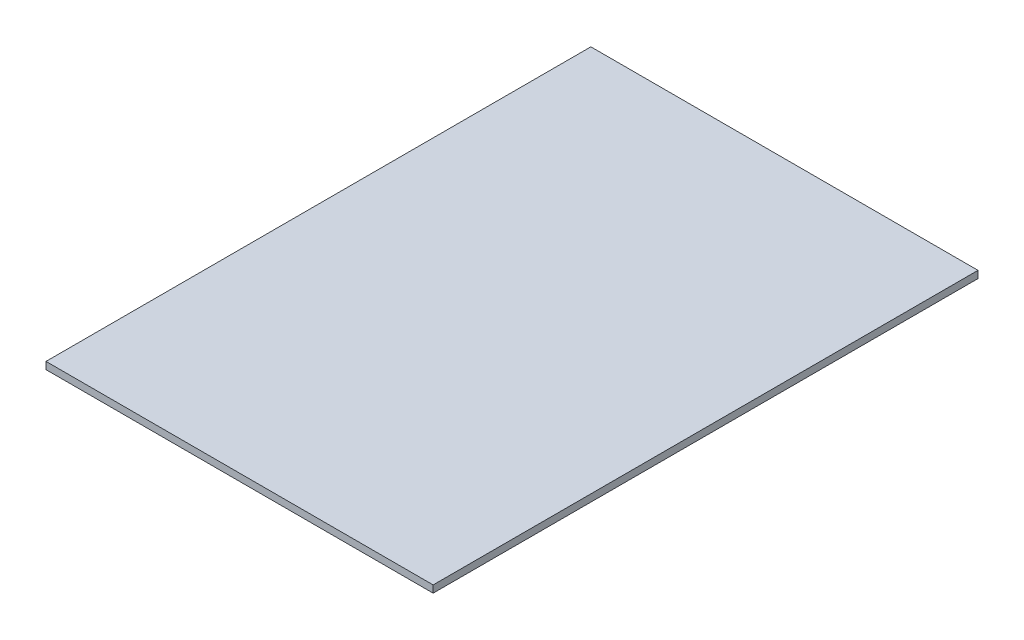
ISO-10303-21;
HEADER;
FILE_DESCRIPTION(('STEP AP214'),'2;1');
FILE_NAME('part.step','',(''),(''),'','','');
FILE_SCHEMA(('AUTOMOTIVE_DESIGN { 1 0 10303 214 1 1 1 1 }'));
ENDSEC;
DATA;
#1=APPLICATION_CONTEXT('core data for automotive mechanical design processes');
#2=APPLICATION_PROTOCOL_DEFINITION('international standard','automotive_design',2000,#1);
#3=PRODUCT_CONTEXT('',#1,'mechanical');
#4=PRODUCT('Part','Part','',(#3));
#5=PRODUCT_RELATED_PRODUCT_CATEGORY('part','',(#4));
#6=PRODUCT_DEFINITION_FORMATION('','',#4);
#7=PRODUCT_DEFINITION_CONTEXT('part definition',#1,'design');
#8=PRODUCT_DEFINITION('design','',#6,#7);
#9=PRODUCT_DEFINITION_SHAPE('','',#8);
#10=(LENGTH_UNIT() NAMED_UNIT(*) SI_UNIT(.MILLI.,.METRE.));
#11=(NAMED_UNIT(*) PLANE_ANGLE_UNIT() SI_UNIT($,.RADIAN.));
#12=(NAMED_UNIT(*) SI_UNIT($,.STERADIAN.) SOLID_ANGLE_UNIT());
#13=UNCERTAINTY_MEASURE_WITH_UNIT(LENGTH_MEASURE(1.E-05),#10,'distance_accuracy_value','');
#14=(GEOMETRIC_REPRESENTATION_CONTEXT(3) GLOBAL_UNCERTAINTY_ASSIGNED_CONTEXT((#13)) GLOBAL_UNIT_ASSIGNED_CONTEXT((#10,
#11,#12)) REPRESENTATION_CONTEXT('',''));
#15=CARTESIAN_POINT('',(0.,0.,0.));
#16=DIRECTION('',(0.,0.,1.));
#17=DIRECTION('',(1.,0.,0.));
#18=AXIS2_PLACEMENT_3D('',#15,#16,#17);
#19=CARTESIAN_POINT('',(5.00000000000006,44.9999999999995,380.));
#20=DIRECTION('',(1.,0.,0.));
#21=DIRECTION('',(0.,0.,-1.));
#22=AXIS2_PLACEMENT_3D('',#19,#20,#21);
#23=PLANE('',#22);
#24=DIRECTION('',(0.,-1.,0.));
#25=VECTOR('',#24,1.);
#26=CARTESIAN_POINT('',(5.00000000000006,44.9999999999995,0.));
#27=LINE('',#26,#25);
#28=CARTESIAN_POINT('',(5.00000000000006,49.9999999999995,0.));
#29=VERTEX_POINT('',#28);
#30=CARTESIAN_POINT('',(5.00000000000006,44.9999999999995,0.));
#31=VERTEX_POINT('',#30);
#32=EDGE_CURVE('E96',#29,#31,#27,.T.);
#33=ORIENTED_EDGE('',*,*,#32,.T.);
#34=DIRECTION('',(0.,0.,-1.));
#35=VECTOR('',#34,1.);
#36=CARTESIAN_POINT('',(5.00000000000006,44.9999999999995,380.));
#37=LINE('',#36,#35);
#38=CARTESIAN_POINT('',(5.00000000000006,44.9999999999995,380.));
#39=VERTEX_POINT('',#38);
#40=EDGE_CURVE('E11',#39,#31,#37,.T.);
#41=ORIENTED_EDGE('',*,*,#40,.F.);
#42=DIRECTION('',(0.,-1.,0.));
#43=VECTOR('',#42,1.);
#44=CARTESIAN_POINT('',(5.00000000000006,44.9999999999995,380.));
#45=LINE('',#44,#43);
#46=CARTESIAN_POINT('',(5.00000000000006,49.9999999999995,380.));
#47=VERTEX_POINT('',#46);
#48=EDGE_CURVE('E84',#47,#39,#45,.T.);
#49=ORIENTED_EDGE('',*,*,#48,.F.);
#50=DIRECTION('',(0.,0.,-1.));
#51=VECTOR('',#50,1.);
#52=CARTESIAN_POINT('',(5.00000000000006,49.9999999999995,380.));
#53=LINE('',#52,#51);
#54=EDGE_CURVE('E92',#47,#29,#53,.T.);
#55=ORIENTED_EDGE('',*,*,#54,.T.);
#56=EDGE_LOOP('',(#33,#41,#49,#55));
#57=FACE_BOUND('',#56,.T.);
#58=ADVANCED_FACE('F33',(#57),#23,.F.);
#59=CARTESIAN_POINT('',(5.00000000000006,44.9999999999995,380.));
#60=DIRECTION('',(0.,1.,0.));
#61=DIRECTION('',(0.,0.,1.));
#62=AXIS2_PLACEMENT_3D('',#59,#60,#61);
#63=PLANE('',#62);
#64=DIRECTION('',(1.,0.,0.));
#65=VECTOR('',#64,1.);
#66=CARTESIAN_POINT('',(5.00000000000006,44.9999999999995,0.));
#67=LINE('',#66,#65);
#68=CARTESIAN_POINT('',(275.,44.9999999999995,0.));
#69=VERTEX_POINT('',#68);
#70=EDGE_CURVE('E88',#31,#69,#67,.T.);
#71=ORIENTED_EDGE('',*,*,#70,.T.);
#72=DIRECTION('',(0.,0.,-1.));
#73=VECTOR('',#72,1.);
#74=CARTESIAN_POINT('',(275.,44.9999999999995,380.));
#75=LINE('',#74,#73);
#76=CARTESIAN_POINT('',(275.,44.9999999999995,380.));
#77=VERTEX_POINT('',#76);
#78=EDGE_CURVE('E41',#77,#69,#75,.T.);
#79=ORIENTED_EDGE('',*,*,#78,.F.);
#80=DIRECTION('',(1.,0.,0.));
#81=VECTOR('',#80,1.);
#82=CARTESIAN_POINT('',(5.00000000000006,44.9999999999995,380.));
#83=LINE('',#82,#81);
#84=EDGE_CURVE('E79',#39,#77,#83,.T.);
#85=ORIENTED_EDGE('',*,*,#84,.F.);
#86=ORIENTED_EDGE('',*,*,#40,.T.);
#87=EDGE_LOOP('',(#71,#79,#85,#86));
#88=FACE_BOUND('',#87,.T.);
#89=ADVANCED_FACE('F87',(#88),#63,.F.);
#90=CARTESIAN_POINT('',(275.,44.9999999999995,380.));
#91=DIRECTION('',(-1.,0.,0.));
#92=DIRECTION('',(0.,0.,1.));
#93=AXIS2_PLACEMENT_3D('',#90,#91,#92);
#94=PLANE('',#93);
#95=DIRECTION('',(0.,1.,0.));
#96=VECTOR('',#95,1.);
#97=CARTESIAN_POINT('',(275.,44.9999999999995,0.));
#98=LINE('',#97,#96);
#99=CARTESIAN_POINT('',(275.,49.9999999999995,0.));
#100=VERTEX_POINT('',#99);
#101=EDGE_CURVE('E66',#69,#100,#98,.T.);
#102=ORIENTED_EDGE('',*,*,#101,.T.);
#103=DIRECTION('',(0.,0.,-1.));
#104=VECTOR('',#103,1.);
#105=CARTESIAN_POINT('',(275.,49.9999999999995,380.));
#106=LINE('',#105,#104);
#107=CARTESIAN_POINT('',(275.,49.9999999999995,380.));
#108=VERTEX_POINT('',#107);
#109=EDGE_CURVE('E89',#108,#100,#106,.T.);
#110=ORIENTED_EDGE('',*,*,#109,.F.);
#111=DIRECTION('',(0.,1.,0.));
#112=VECTOR('',#111,1.);
#113=CARTESIAN_POINT('',(275.,44.9999999999995,380.));
#114=LINE('',#113,#112);
#115=EDGE_CURVE('E82',#77,#108,#114,.T.);
#116=ORIENTED_EDGE('',*,*,#115,.F.);
#117=ORIENTED_EDGE('',*,*,#78,.T.);
#118=EDGE_LOOP('',(#102,#110,#116,#117));
#119=FACE_BOUND('',#118,.T.);
#120=ADVANCED_FACE('F90',(#119),#94,.F.);
#121=CARTESIAN_POINT('',(5.00000000000006,49.9999999999995,380.));
#122=DIRECTION('',(0.,-1.,0.));
#123=DIRECTION('',(1.,0.,0.));
#124=AXIS2_PLACEMENT_3D('',#121,#122,#123);
#125=PLANE('',#124);
#126=DIRECTION('',(-1.,0.,0.));
#127=VECTOR('',#126,1.);
#128=CARTESIAN_POINT('',(5.00000000000006,49.9999999999995,0.));
#129=LINE('',#128,#127);
#130=EDGE_CURVE('E72',#100,#29,#129,.T.);
#131=ORIENTED_EDGE('',*,*,#130,.T.);
#132=ORIENTED_EDGE('',*,*,#54,.F.);
#133=DIRECTION('',(-1.,0.,0.));
#134=VECTOR('',#133,1.);
#135=CARTESIAN_POINT('',(5.00000000000006,49.9999999999995,380.));
#136=LINE('',#135,#134);
#137=EDGE_CURVE('E49',#108,#47,#136,.T.);
#138=ORIENTED_EDGE('',*,*,#137,.F.);
#139=ORIENTED_EDGE('',*,*,#109,.T.);
#140=EDGE_LOOP('',(#131,#132,#138,#139));
#141=FACE_BOUND('',#140,.T.);
#142=ADVANCED_FACE('F103',(#141),#125,.F.);
#143=CARTESIAN_POINT('',(0.,0.,380.));
#144=DIRECTION('',(0.,0.,-1.));
#145=DIRECTION('',(-1.,0.,0.));
#146=AXIS2_PLACEMENT_3D('',#143,#144,#145);
#147=PLANE('',#146);
#148=ORIENTED_EDGE('',*,*,#48,.T.);
#149=ORIENTED_EDGE('',*,*,#84,.T.);
#150=ORIENTED_EDGE('',*,*,#115,.T.);
#151=ORIENTED_EDGE('',*,*,#137,.T.);
#152=EDGE_LOOP('',(#148,#149,#150,#151));
#153=FACE_BOUND('',#152,.T.);
#154=ADVANCED_FACE('F80',(#153),#147,.F.);
#155=CARTESIAN_POINT('',(0.,0.,0.));
#156=DIRECTION('',(0.,0.,-1.));
#157=DIRECTION('',(-1.,0.,0.));
#158=AXIS2_PLACEMENT_3D('',#155,#156,#157);
#159=PLANE('',#158);
#160=ORIENTED_EDGE('',*,*,#32,.F.);
#161=ORIENTED_EDGE('',*,*,#130,.F.);
#162=ORIENTED_EDGE('',*,*,#101,.F.);
#163=ORIENTED_EDGE('',*,*,#70,.F.);
#164=EDGE_LOOP('',(#160,#161,#162,#163));
#165=FACE_BOUND('',#164,.T.);
#166=ADVANCED_FACE('F106',(#165),#159,.T.);
#167=CLOSED_SHELL('',(#58,#89,#120,#142,#154,#166));
#168=MANIFOLD_SOLID_BREP('B2',#167);
#169=ADVANCED_BREP_SHAPE_REPRESENTATION('',(#18,#168),#14);
#170=SHAPE_DEFINITION_REPRESENTATION(#9,#169);
ENDSEC;
END-ISO-10303-21;
